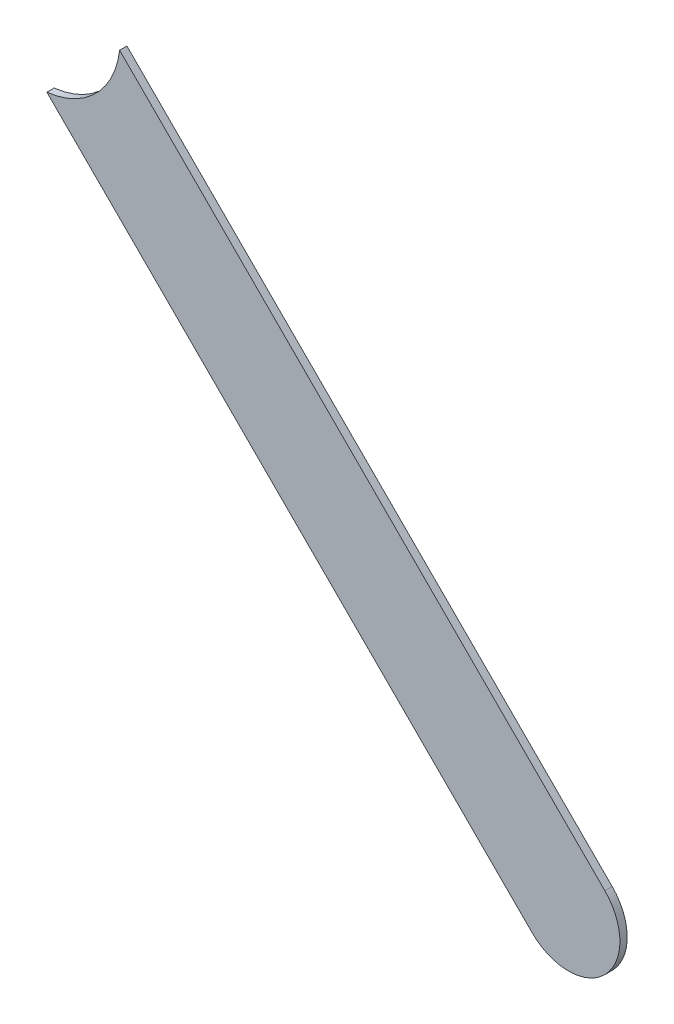
ISO-10303-21;
HEADER;
FILE_DESCRIPTION(('STEP AP214'),'2;1');
FILE_NAME('part.step','',(''),(''),'','','');
FILE_SCHEMA(('AUTOMOTIVE_DESIGN { 1 0 10303 214 1 1 1 1 }'));
ENDSEC;
DATA;
#1=APPLICATION_CONTEXT('core data for automotive mechanical design processes');
#2=APPLICATION_PROTOCOL_DEFINITION('international standard','automotive_design',2000,#1);
#3=PRODUCT_CONTEXT('',#1,'mechanical');
#4=PRODUCT('Part','Part','',(#3));
#5=PRODUCT_RELATED_PRODUCT_CATEGORY('part','',(#4));
#6=PRODUCT_DEFINITION_FORMATION('','',#4);
#7=PRODUCT_DEFINITION_CONTEXT('part definition',#1,'design');
#8=PRODUCT_DEFINITION('design','',#6,#7);
#9=PRODUCT_DEFINITION_SHAPE('','',#8);
#10=(LENGTH_UNIT() NAMED_UNIT(*) SI_UNIT(.MILLI.,.METRE.));
#11=(NAMED_UNIT(*) PLANE_ANGLE_UNIT() SI_UNIT($,.RADIAN.));
#12=(NAMED_UNIT(*) SI_UNIT($,.STERADIAN.) SOLID_ANGLE_UNIT());
#13=UNCERTAINTY_MEASURE_WITH_UNIT(LENGTH_MEASURE(1.E-05),#10,'distance_accuracy_value','');
#14=(GEOMETRIC_REPRESENTATION_CONTEXT(3) GLOBAL_UNCERTAINTY_ASSIGNED_CONTEXT((#13)) GLOBAL_UNIT_ASSIGNED_CONTEXT((#10,
#11,#12)) REPRESENTATION_CONTEXT('',''));
#15=CARTESIAN_POINT('',(0.,0.,0.));
#16=DIRECTION('',(0.,0.,1.));
#17=DIRECTION('',(1.,0.,0.));
#18=AXIS2_PLACEMENT_3D('',#15,#16,#17);
#19=CARTESIAN_POINT('',(74.4440207694402,90.1824368705598,0.));
#20=DIRECTION('',(0.707106781186548,0.707106781186548,0.));
#21=DIRECTION('',(0.707106781186548,-0.707106781186548,0.));
#22=AXIS2_PLACEMENT_3D('',#19,#20,#21);
#23=PLANE('',#22);
#24=DIRECTION('',(0.707106781186548,-0.707106781186548,0.));
#25=VECTOR('',#24,1.);
#26=CARTESIAN_POINT('',(74.22322722,90.40323042,0.03556));
#27=LINE('',#26,#25);
#28=CARTESIAN_POINT('',(74.4440207694402,90.1824368705598,0.03556));
#29=VERTEX_POINT('',#28);
#30=CARTESIAN_POINT('',(76.80325762,87.82320002,0.03556));
#31=VERTEX_POINT('',#30);
#32=EDGE_CURVE('E11',#29,#31,#27,.T.);
#33=ORIENTED_EDGE('',*,*,#32,.F.);
#34=DIRECTION('',(0.,0.,1.));
#35=VECTOR('',#34,1.);
#36=CARTESIAN_POINT('',(74.4440207694402,90.1824368705598,0.));
#37=LINE('',#36,#35);
#38=CARTESIAN_POINT('',(74.4440207694402,90.1824368705598,0.));
#39=VERTEX_POINT('',#38);
#40=EDGE_CURVE('E24',#39,#29,#37,.T.);
#41=ORIENTED_EDGE('',*,*,#40,.F.);
#42=DIRECTION('',(0.707106781186548,-0.707106781186548,0.));
#43=VECTOR('',#42,1.);
#44=CARTESIAN_POINT('',(74.22322722,90.40323042,0.));
#45=LINE('',#44,#43);
#46=CARTESIAN_POINT('',(76.80325762,87.82320002,0.));
#47=VERTEX_POINT('',#46);
#48=EDGE_CURVE('E75',#39,#47,#45,.T.);
#49=ORIENTED_EDGE('',*,*,#48,.T.);
#50=DIRECTION('',(0.,0.,1.));
#51=VECTOR('',#50,1.);
#52=CARTESIAN_POINT('',(76.80325762,87.82320002,0.));
#53=LINE('',#52,#51);
#54=EDGE_CURVE('E37',#47,#31,#53,.T.);
#55=ORIENTED_EDGE('',*,*,#54,.T.);
#56=EDGE_LOOP('',(#33,#41,#49,#55));
#57=FACE_BOUND('',#56,.T.);
#58=ADVANCED_FACE('F17',(#57),#23,.F.);
#59=CARTESIAN_POINT('',(76.980034,87.9999764,0.));
#60=DIRECTION('',(0.,0.,-1.));
#61=DIRECTION('',(-0.707106781186548,-0.707106781186548,0.));
#62=AXIS2_PLACEMENT_3D('',#59,#60,#61);
#63=CYLINDRICAL_SURFACE('',#62,0.249999554103216);
#64=CARTESIAN_POINT('',(76.980034,87.9999764,0.03556));
#65=DIRECTION('',(0.,0.,1.));
#66=DIRECTION('',(-0.707106781186548,-0.707106781186548,0.));
#67=AXIS2_PLACEMENT_3D('',#64,#65,#66);
#68=CIRCLE('',#67,0.249999554103216);
#69=CARTESIAN_POINT('',(77.15681038,88.17675278,0.03556));
#70=VERTEX_POINT('',#69);
#71=EDGE_CURVE('E83',#31,#70,#68,.T.);
#72=ORIENTED_EDGE('',*,*,#71,.F.);
#73=ORIENTED_EDGE('',*,*,#54,.F.);
#74=CARTESIAN_POINT('',(76.980034,87.9999764,0.));
#75=DIRECTION('',(0.,0.,1.));
#76=DIRECTION('',(-0.707106781186548,-0.707106781186548,0.));
#77=AXIS2_PLACEMENT_3D('',#74,#75,#76);
#78=CIRCLE('',#77,0.249999554103216);
#79=CARTESIAN_POINT('',(77.15681038,88.17675278,0.));
#80=VERTEX_POINT('',#79);
#81=EDGE_CURVE('E81',#47,#80,#78,.T.);
#82=ORIENTED_EDGE('',*,*,#81,.T.);
#83=DIRECTION('',(0.,0.,1.));
#84=VECTOR('',#83,1.);
#85=CARTESIAN_POINT('',(77.15681038,88.17675278,0.));
#86=LINE('',#85,#84);
#87=EDGE_CURVE('E67',#80,#70,#86,.T.);
#88=ORIENTED_EDGE('',*,*,#87,.T.);
#89=EDGE_LOOP('',(#72,#73,#82,#88));
#90=FACE_BOUND('',#89,.T.);
#91=ADVANCED_FACE('F89',(#90),#63,.T.);
#92=CARTESIAN_POINT('',(77.15681038,88.17675278,0.));
#93=DIRECTION('',(-0.70710678118655,-0.707106781186546,0.));
#94=DIRECTION('',(-0.707106781186546,0.70710678118655,0.));
#95=AXIS2_PLACEMENT_3D('',#92,#93,#94);
#96=PLANE('',#95);
#97=DIRECTION('',(-0.707106781186546,0.70710678118655,0.));
#98=VECTOR('',#97,1.);
#99=CARTESIAN_POINT('',(77.15681038,88.17675278,0.03556));
#100=LINE('',#99,#98);
#101=CARTESIAN_POINT('',(74.7975735294402,90.5359896305598,0.03556));
#102=VERTEX_POINT('',#101);
#103=EDGE_CURVE('E71',#70,#102,#100,.T.);
#104=ORIENTED_EDGE('',*,*,#103,.F.);
#105=ORIENTED_EDGE('',*,*,#87,.F.);
#106=DIRECTION('',(-0.707106781186546,0.70710678118655,0.));
#107=VECTOR('',#106,1.);
#108=CARTESIAN_POINT('',(77.15681038,88.17675278,0.));
#109=LINE('',#108,#107);
#110=CARTESIAN_POINT('',(74.7975735294402,90.5359896305598,0.));
#111=VERTEX_POINT('',#110);
#112=EDGE_CURVE('E63',#80,#111,#109,.T.);
#113=ORIENTED_EDGE('',*,*,#112,.T.);
#114=DIRECTION('',(0.,0.,1.));
#115=VECTOR('',#114,1.);
#116=CARTESIAN_POINT('',(74.7975735294402,90.5359896305598,0.));
#117=LINE('',#116,#115);
#118=EDGE_CURVE('E53',#111,#102,#117,.T.);
#119=ORIENTED_EDGE('',*,*,#118,.T.);
#120=EDGE_LOOP('',(#104,#105,#113,#119));
#121=FACE_BOUND('',#120,.T.);
#122=ADVANCED_FACE('F66',(#121),#96,.F.);
#123=CARTESIAN_POINT('',(74.4000036,90.5800068,0.));
#124=DIRECTION('',(0.,0.,-1.));
#125=DIRECTION('',(1.,0.,0.));
#126=AXIS2_PLACEMENT_3D('',#123,#124,#125);
#127=CYLINDRICAL_SURFACE('',#126,0.3999992);
#128=ORIENTED_EDGE('',*,*,#40,.T.);
#129=CARTESIAN_POINT('',(74.4000036,90.5800068,0.03556));
#130=DIRECTION('',(0.,0.,1.));
#131=DIRECTION('',(1.,0.,0.));
#132=AXIS2_PLACEMENT_3D('',#129,#130,#131);
#133=CIRCLE('',#132,0.3999992);
#134=EDGE_CURVE('E59',#29,#102,#133,.T.);
#135=ORIENTED_EDGE('',*,*,#134,.T.);
#136=ORIENTED_EDGE('',*,*,#118,.F.);
#137=CARTESIAN_POINT('',(74.4000036,90.5800068,0.));
#138=DIRECTION('',(0.,0.,1.));
#139=DIRECTION('',(1.,0.,0.));
#140=AXIS2_PLACEMENT_3D('',#137,#138,#139);
#141=CIRCLE('',#140,0.3999992);
#142=EDGE_CURVE('E57',#39,#111,#141,.T.);
#143=ORIENTED_EDGE('',*,*,#142,.F.);
#144=EDGE_LOOP('',(#128,#135,#136,#143));
#145=FACE_BOUND('',#144,.T.);
#146=ADVANCED_FACE('F55',(#145),#127,.F.);
#147=CARTESIAN_POINT('',(74.22322722,90.40323042,0.));
#148=DIRECTION('',(0.,0.,-1.));
#149=DIRECTION('',(-1.,0.,0.));
#150=AXIS2_PLACEMENT_3D('',#147,#148,#149);
#151=PLANE('',#150);
#152=ORIENTED_EDGE('',*,*,#48,.F.);
#153=ORIENTED_EDGE('',*,*,#142,.T.);
#154=ORIENTED_EDGE('',*,*,#112,.F.);
#155=ORIENTED_EDGE('',*,*,#81,.F.);
#156=EDGE_LOOP('',(#152,#153,#154,#155));
#157=FACE_BOUND('',#156,.T.);
#158=ADVANCED_FACE('F74',(#157),#151,.T.);
#159=CARTESIAN_POINT('',(74.22322722,90.40323042,0.03556));
#160=DIRECTION('',(0.,0.,-1.));
#161=DIRECTION('',(-1.,0.,0.));
#162=AXIS2_PLACEMENT_3D('',#159,#160,#161);
#163=PLANE('',#162);
#164=ORIENTED_EDGE('',*,*,#134,.F.);
#165=ORIENTED_EDGE('',*,*,#32,.T.);
#166=ORIENTED_EDGE('',*,*,#71,.T.);
#167=ORIENTED_EDGE('',*,*,#103,.T.);
#168=EDGE_LOOP('',(#164,#165,#166,#167));
#169=FACE_BOUND('',#168,.T.);
#170=ADVANCED_FACE('F91',(#169),#163,.F.);
#171=CLOSED_SHELL('',(#58,#91,#122,#146,#158,#170));
#172=MANIFOLD_SOLID_BREP('B1',#171);
#173=ADVANCED_BREP_SHAPE_REPRESENTATION('',(#18,#172),#14);
#174=SHAPE_DEFINITION_REPRESENTATION(#9,#173);
ENDSEC;
END-ISO-10303-21;
